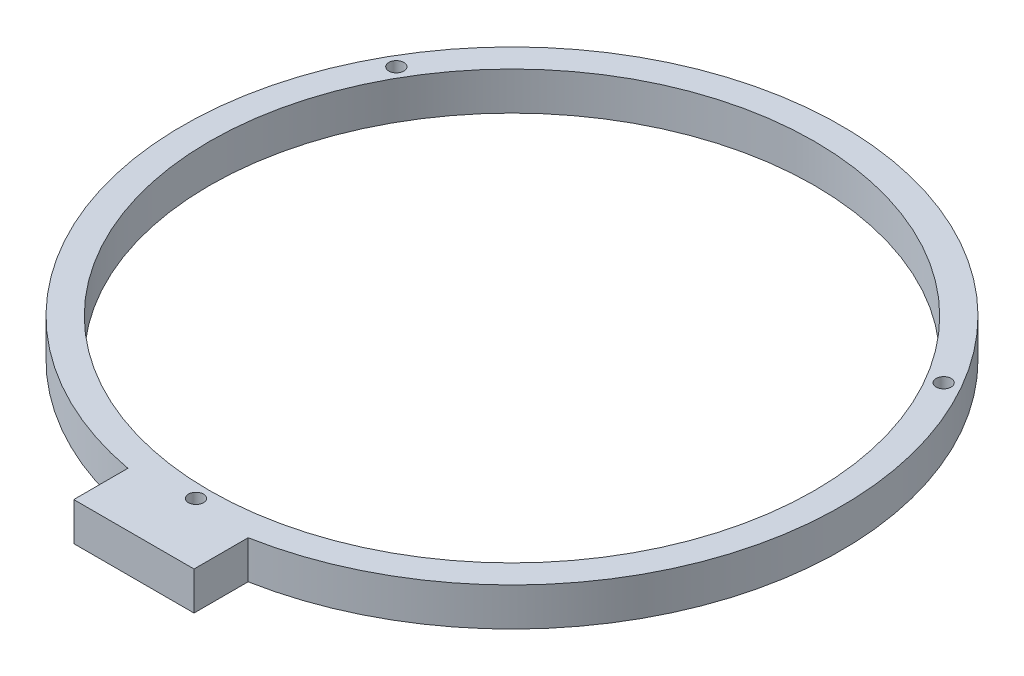
ISO-10303-21;
HEADER;
FILE_DESCRIPTION(('STEP AP214'),'2;1');
FILE_NAME('part.step','',(''),(''),'','','');
FILE_SCHEMA(('AUTOMOTIVE_DESIGN { 1 0 10303 214 1 1 1 1 }'));
ENDSEC;
DATA;
#1=APPLICATION_CONTEXT('core data for automotive mechanical design processes');
#2=APPLICATION_PROTOCOL_DEFINITION('international standard','automotive_design',2000,#1);
#3=PRODUCT_CONTEXT('',#1,'mechanical');
#4=PRODUCT('Part','Part','',(#3));
#5=PRODUCT_RELATED_PRODUCT_CATEGORY('part','',(#4));
#6=PRODUCT_DEFINITION_FORMATION('','',#4);
#7=PRODUCT_DEFINITION_CONTEXT('part definition',#1,'design');
#8=PRODUCT_DEFINITION('design','',#6,#7);
#9=PRODUCT_DEFINITION_SHAPE('','',#8);
#10=(LENGTH_UNIT() NAMED_UNIT(*) SI_UNIT(.MILLI.,.METRE.));
#11=(NAMED_UNIT(*) PLANE_ANGLE_UNIT() SI_UNIT($,.RADIAN.));
#12=(NAMED_UNIT(*) SI_UNIT($,.STERADIAN.) SOLID_ANGLE_UNIT());
#13=UNCERTAINTY_MEASURE_WITH_UNIT(LENGTH_MEASURE(1.E-05),#10,'distance_accuracy_value','');
#14=(GEOMETRIC_REPRESENTATION_CONTEXT(3) GLOBAL_UNCERTAINTY_ASSIGNED_CONTEXT((#13)) GLOBAL_UNIT_ASSIGNED_CONTEXT((#10,
#11,#12)) REPRESENTATION_CONTEXT('',''));
#15=CARTESIAN_POINT('',(0.,0.,0.));
#16=DIRECTION('',(0.,0.,1.));
#17=DIRECTION('',(1.,0.,0.));
#18=AXIS2_PLACEMENT_3D('',#15,#16,#17);
#19=CARTESIAN_POINT('',(0.,6.35,0.));
#20=DIRECTION('',(0.,1.,0.));
#21=DIRECTION('',(0.,0.,1.));
#22=AXIS2_PLACEMENT_3D('',#19,#20,#21);
#23=PLANE('',#22);
#24=CARTESIAN_POINT('',(45.5096349688721,6.35,-26.2750000000002));
#25=DIRECTION('',(0.,1.,0.));
#26=DIRECTION('',(0.866025403784436,0.,-0.500000000000004));
#27=AXIS2_PLACEMENT_3D('',#24,#25,#26);
#28=CIRCLE('',#27,1.25);
#29=CARTESIAN_POINT('',(46.5921667236027,6.35,-26.9000000000002));
#30=VERTEX_POINT('',#29);
#31=EDGE_CURVE('E154',#30,#30,#28,.T.);
#32=ORIENTED_EDGE('',*,*,#31,.F.);
#33=EDGE_LOOP('',(#32));
#34=FACE_BOUND('',#33,.T.);
#35=CARTESIAN_POINT('',(-45.5096349688725,6.35,-26.2749999999996));
#36=DIRECTION('',(0.,1.,0.));
#37=DIRECTION('',(-0.866025403784443,0.,-0.499999999999992));
#38=AXIS2_PLACEMENT_3D('',#35,#36,#37);
#39=CIRCLE('',#38,1.25);
#40=CARTESIAN_POINT('',(-46.592166723603,6.35,-26.8999999999996));
#41=VERTEX_POINT('',#40);
#42=EDGE_CURVE('E155',#41,#41,#39,.T.);
#43=ORIENTED_EDGE('',*,*,#42,.F.);
#44=EDGE_LOOP('',(#43));
#45=FACE_BOUND('',#44,.T.);
#46=CARTESIAN_POINT('',(0.,6.35,52.55));
#47=DIRECTION('',(0.,1.,0.));
#48=DIRECTION('',(0.,0.,1.));
#49=AXIS2_PLACEMENT_3D('',#46,#47,#48);
#50=CIRCLE('',#49,1.25);
#51=CARTESIAN_POINT('',(0.,6.35,53.8));
#52=VERTEX_POINT('',#51);
#53=EDGE_CURVE('E145',#52,#52,#50,.T.);
#54=ORIENTED_EDGE('',*,*,#53,.F.);
#55=EDGE_LOOP('',(#54));
#56=FACE_BOUND('',#55,.T.);
#57=CARTESIAN_POINT('',(0.,6.35,0.));
#58=DIRECTION('',(0.,1.,0.));
#59=DIRECTION('',(0.,0.,1.));
#60=AXIS2_PLACEMENT_3D('',#57,#58,#59);
#61=CIRCLE('',#60,54.8);
#62=CARTESIAN_POINT('',(10.,6.35,53.8798663695448));
#63=VERTEX_POINT('',#62);
#64=CARTESIAN_POINT('',(-10.,6.35,53.8798663695448));
#65=VERTEX_POINT('',#64);
#66=EDGE_CURVE('E96',#63,#65,#61,.T.);
#67=ORIENTED_EDGE('',*,*,#66,.T.);
#68=DIRECTION('',(0.,0.,1.));
#69=VECTOR('',#68,1.);
#70=CARTESIAN_POINT('',(-10.,6.35,53.8798663695448));
#71=LINE('',#70,#69);
#72=CARTESIAN_POINT('',(-10.,6.35,62.8798663695448));
#73=VERTEX_POINT('',#72);
#74=EDGE_CURVE('E91',#65,#73,#71,.T.);
#75=ORIENTED_EDGE('',*,*,#74,.T.);
#76=DIRECTION('',(1.,0.,0.));
#77=VECTOR('',#76,1.);
#78=CARTESIAN_POINT('',(-10.,6.35,62.8798663695448));
#79=LINE('',#78,#77);
#80=CARTESIAN_POINT('',(10.,6.35,62.8798663695448));
#81=VERTEX_POINT('',#80);
#82=EDGE_CURVE('E94',#73,#81,#79,.T.);
#83=ORIENTED_EDGE('',*,*,#82,.T.);
#84=DIRECTION('',(0.,0.,-1.));
#85=VECTOR('',#84,1.);
#86=CARTESIAN_POINT('',(10.,6.35,62.8798663695448));
#87=LINE('',#86,#85);
#88=EDGE_CURVE('E61',#81,#63,#87,.T.);
#89=ORIENTED_EDGE('',*,*,#88,.T.);
#90=EDGE_LOOP('',(#67,#75,#83,#89));
#91=FACE_BOUND('',#90,.T.);
#92=CARTESIAN_POINT('',(0.,6.35,0.));
#93=DIRECTION('',(0.,1.,0.));
#94=DIRECTION('',(0.,0.,1.));
#95=AXIS2_PLACEMENT_3D('',#92,#93,#94);
#96=CIRCLE('',#95,50.3);
#97=CARTESIAN_POINT('',(0.,6.35,50.3));
#98=VERTEX_POINT('',#97);
#99=EDGE_CURVE('E116',#98,#98,#96,.T.);
#100=ORIENTED_EDGE('',*,*,#99,.F.);
#101=EDGE_LOOP('',(#100));
#102=FACE_BOUND('',#101,.T.);
#103=ADVANCED_FACE('F43',(#34,#45,#56,#91,#102),#23,.T.);
#104=CARTESIAN_POINT('',(0.,0.,0.));
#105=DIRECTION('',(0.,1.,0.));
#106=DIRECTION('',(0.,0.,1.));
#107=AXIS2_PLACEMENT_3D('',#104,#105,#106);
#108=PLANE('',#107);
#109=CARTESIAN_POINT('',(45.5096349688721,0.,-26.2750000000002));
#110=DIRECTION('',(0.,1.,0.));
#111=DIRECTION('',(0.,0.,1.));
#112=AXIS2_PLACEMENT_3D('',#109,#110,#111);
#113=CIRCLE('',#112,1.25);
#114=CARTESIAN_POINT('',(45.5096349688721,0.,-25.0250000000002));
#115=VERTEX_POINT('',#114);
#116=EDGE_CURVE('E149',#115,#115,#113,.F.);
#117=ORIENTED_EDGE('',*,*,#116,.F.);
#118=EDGE_LOOP('',(#117));
#119=FACE_BOUND('',#118,.T.);
#120=CARTESIAN_POINT('',(-45.5096349688725,0.,-26.2749999999996));
#121=DIRECTION('',(0.,1.,0.));
#122=DIRECTION('',(0.,0.,1.));
#123=AXIS2_PLACEMENT_3D('',#120,#121,#122);
#124=CIRCLE('',#123,1.25);
#125=CARTESIAN_POINT('',(-45.5096349688725,0.,-25.0249999999996));
#126=VERTEX_POINT('',#125);
#127=EDGE_CURVE('E150',#126,#126,#124,.F.);
#128=ORIENTED_EDGE('',*,*,#127,.F.);
#129=EDGE_LOOP('',(#128));
#130=FACE_BOUND('',#129,.T.);
#131=CARTESIAN_POINT('',(0.,0.,52.55));
#132=DIRECTION('',(0.,1.,0.));
#133=DIRECTION('',(0.,0.,1.));
#134=AXIS2_PLACEMENT_3D('',#131,#132,#133);
#135=CIRCLE('',#134,1.25);
#136=CARTESIAN_POINT('',(0.,0.,53.8));
#137=VERTEX_POINT('',#136);
#138=EDGE_CURVE('E138',#137,#137,#135,.F.);
#139=ORIENTED_EDGE('',*,*,#138,.F.);
#140=EDGE_LOOP('',(#139));
#141=FACE_BOUND('',#140,.T.);
#142=CARTESIAN_POINT('',(0.,0.,0.));
#143=DIRECTION('',(0.,1.,0.));
#144=DIRECTION('',(0.,0.,1.));
#145=AXIS2_PLACEMENT_3D('',#142,#143,#144);
#146=CIRCLE('',#145,54.8);
#147=CARTESIAN_POINT('',(10.,0.,53.8798663695448));
#148=VERTEX_POINT('',#147);
#149=CARTESIAN_POINT('',(-10.,0.,53.8798663695448));
#150=VERTEX_POINT('',#149);
#151=EDGE_CURVE('E112',#148,#150,#146,.T.);
#152=ORIENTED_EDGE('',*,*,#151,.F.);
#153=DIRECTION('',(0.,0.,-1.));
#154=VECTOR('',#153,1.);
#155=CARTESIAN_POINT('',(10.,0.,62.8798663695448));
#156=LINE('',#155,#154);
#157=CARTESIAN_POINT('',(10.,0.,62.8798663695448));
#158=VERTEX_POINT('',#157);
#159=EDGE_CURVE('E84',#158,#148,#156,.T.);
#160=ORIENTED_EDGE('',*,*,#159,.F.);
#161=DIRECTION('',(1.,0.,0.));
#162=VECTOR('',#161,1.);
#163=CARTESIAN_POINT('',(-10.,0.,62.8798663695448));
#164=LINE('',#163,#162);
#165=CARTESIAN_POINT('',(-10.,0.,62.8798663695448));
#166=VERTEX_POINT('',#165);
#167=EDGE_CURVE('E78',#166,#158,#164,.T.);
#168=ORIENTED_EDGE('',*,*,#167,.F.);
#169=DIRECTION('',(0.,0.,1.));
#170=VECTOR('',#169,1.);
#171=CARTESIAN_POINT('',(-10.,0.,53.8798663695448));
#172=LINE('',#171,#170);
#173=EDGE_CURVE('E101',#150,#166,#172,.T.);
#174=ORIENTED_EDGE('',*,*,#173,.F.);
#175=EDGE_LOOP('',(#152,#160,#168,#174));
#176=FACE_BOUND('',#175,.T.);
#177=CARTESIAN_POINT('',(0.,0.,0.));
#178=DIRECTION('',(0.,1.,0.));
#179=DIRECTION('',(0.,0.,1.));
#180=AXIS2_PLACEMENT_3D('',#177,#178,#179);
#181=CIRCLE('',#180,50.3);
#182=CARTESIAN_POINT('',(0.,0.,50.3));
#183=VERTEX_POINT('',#182);
#184=EDGE_CURVE('E134',#183,#183,#181,.T.);
#185=ORIENTED_EDGE('',*,*,#184,.T.);
#186=EDGE_LOOP('',(#185));
#187=FACE_BOUND('',#186,.T.);
#188=ADVANCED_FACE('F129',(#119,#130,#141,#176,#187),#108,.F.);
#189=CARTESIAN_POINT('',(0.,6.35,0.));
#190=DIRECTION('',(0.,-1.,0.));
#191=DIRECTION('',(0.,0.,-1.));
#192=AXIS2_PLACEMENT_3D('',#189,#190,#191);
#193=CYLINDRICAL_SURFACE('',#192,54.8);
#194=ORIENTED_EDGE('',*,*,#151,.T.);
#195=DIRECTION('',(0.,-1.,0.));
#196=VECTOR('',#195,1.);
#197=CARTESIAN_POINT('',(-10.,6.35,53.8798663695448));
#198=LINE('',#197,#196);
#199=EDGE_CURVE('E11',#65,#150,#198,.T.);
#200=ORIENTED_EDGE('',*,*,#199,.F.);
#201=ORIENTED_EDGE('',*,*,#66,.F.);
#202=DIRECTION('',(0.,-1.,0.));
#203=VECTOR('',#202,1.);
#204=CARTESIAN_POINT('',(10.,6.35,53.8798663695448));
#205=LINE('',#204,#203);
#206=EDGE_CURVE('E108',#63,#148,#205,.T.);
#207=ORIENTED_EDGE('',*,*,#206,.T.);
#208=EDGE_LOOP('',(#194,#200,#201,#207));
#209=FACE_BOUND('',#208,.T.);
#210=ADVANCED_FACE('F45',(#209),#193,.T.);
#211=CARTESIAN_POINT('',(-10.,6.35,53.8798663695448));
#212=DIRECTION('',(1.,0.,0.));
#213=DIRECTION('',(0.,0.,-1.));
#214=AXIS2_PLACEMENT_3D('',#211,#212,#213);
#215=PLANE('',#214);
#216=ORIENTED_EDGE('',*,*,#173,.T.);
#217=DIRECTION('',(0.,-1.,0.));
#218=VECTOR('',#217,1.);
#219=CARTESIAN_POINT('',(-10.,6.35,62.8798663695448));
#220=LINE('',#219,#218);
#221=EDGE_CURVE('E53',#73,#166,#220,.T.);
#222=ORIENTED_EDGE('',*,*,#221,.F.);
#223=ORIENTED_EDGE('',*,*,#74,.F.);
#224=ORIENTED_EDGE('',*,*,#199,.T.);
#225=EDGE_LOOP('',(#216,#222,#223,#224));
#226=FACE_BOUND('',#225,.T.);
#227=ADVANCED_FACE('F100',(#226),#215,.F.);
#228=CARTESIAN_POINT('',(-10.,6.35,62.8798663695448));
#229=DIRECTION('',(0.,0.,-1.));
#230=DIRECTION('',(-1.,0.,0.));
#231=AXIS2_PLACEMENT_3D('',#228,#229,#230);
#232=PLANE('',#231);
#233=ORIENTED_EDGE('',*,*,#167,.T.);
#234=DIRECTION('',(0.,-1.,0.));
#235=VECTOR('',#234,1.);
#236=CARTESIAN_POINT('',(10.,6.35,62.8798663695448));
#237=LINE('',#236,#235);
#238=EDGE_CURVE('E103',#81,#158,#237,.T.);
#239=ORIENTED_EDGE('',*,*,#238,.F.);
#240=ORIENTED_EDGE('',*,*,#82,.F.);
#241=ORIENTED_EDGE('',*,*,#221,.T.);
#242=EDGE_LOOP('',(#233,#239,#240,#241));
#243=FACE_BOUND('',#242,.T.);
#244=ADVANCED_FACE('F104',(#243),#232,.F.);
#245=CARTESIAN_POINT('',(10.,6.35,62.8798663695448));
#246=DIRECTION('',(-1.,0.,0.));
#247=DIRECTION('',(0.,0.,1.));
#248=AXIS2_PLACEMENT_3D('',#245,#246,#247);
#249=PLANE('',#248);
#250=ORIENTED_EDGE('',*,*,#159,.T.);
#251=ORIENTED_EDGE('',*,*,#206,.F.);
#252=ORIENTED_EDGE('',*,*,#88,.F.);
#253=ORIENTED_EDGE('',*,*,#238,.T.);
#254=EDGE_LOOP('',(#250,#251,#252,#253));
#255=FACE_BOUND('',#254,.T.);
#256=ADVANCED_FACE('F126',(#255),#249,.F.);
#257=CARTESIAN_POINT('',(0.,6.35,0.));
#258=DIRECTION('',(0.,-1.,0.));
#259=DIRECTION('',(0.,0.,-1.));
#260=AXIS2_PLACEMENT_3D('',#257,#258,#259);
#261=CYLINDRICAL_SURFACE('',#260,50.3);
#262=ORIENTED_EDGE('',*,*,#99,.T.);
#263=EDGE_LOOP('',(#262));
#264=FACE_BOUND('',#263,.T.);
#265=ORIENTED_EDGE('',*,*,#184,.F.);
#266=EDGE_LOOP('',(#265));
#267=FACE_BOUND('',#266,.T.);
#268=ADVANCED_FACE('F180',(#264,#267),#261,.F.);
#269=CARTESIAN_POINT('',(0.,-0.00100000000000013,52.55));
#270=DIRECTION('',(0.,1.,0.));
#271=DIRECTION('',(0.,0.,1.));
#272=AXIS2_PLACEMENT_3D('',#269,#270,#271);
#273=CYLINDRICAL_SURFACE('',#272,1.25);
#274=ORIENTED_EDGE('',*,*,#53,.T.);
#275=EDGE_LOOP('',(#274));
#276=FACE_BOUND('',#275,.T.);
#277=ORIENTED_EDGE('',*,*,#138,.T.);
#278=EDGE_LOOP('',(#277));
#279=FACE_BOUND('',#278,.T.);
#280=ADVANCED_FACE('F176',(#276,#279),#273,.F.);
#281=CARTESIAN_POINT('',(-45.5096349688725,-0.00100000000000013,-26.2749999999996));
#282=DIRECTION('',(0.,1.,0.));
#283=DIRECTION('',(0.,0.,1.));
#284=AXIS2_PLACEMENT_3D('',#281,#282,#283);
#285=CYLINDRICAL_SURFACE('',#284,1.25);
#286=ORIENTED_EDGE('',*,*,#42,.T.);
#287=EDGE_LOOP('',(#286));
#288=FACE_BOUND('',#287,.T.);
#289=ORIENTED_EDGE('',*,*,#127,.T.);
#290=EDGE_LOOP('',(#289));
#291=FACE_BOUND('',#290,.T.);
#292=ADVANCED_FACE('F179',(#288,#291),#285,.F.);
#293=CARTESIAN_POINT('',(45.5096349688721,-0.00100000000000013,-26.2750000000002));
#294=DIRECTION('',(0.,1.,0.));
#295=DIRECTION('',(0.,0.,1.));
#296=AXIS2_PLACEMENT_3D('',#293,#294,#295);
#297=CYLINDRICAL_SURFACE('',#296,1.25);
#298=ORIENTED_EDGE('',*,*,#31,.T.);
#299=EDGE_LOOP('',(#298));
#300=FACE_BOUND('',#299,.T.);
#301=ORIENTED_EDGE('',*,*,#116,.T.);
#302=EDGE_LOOP('',(#301));
#303=FACE_BOUND('',#302,.T.);
#304=ADVANCED_FACE('F166',(#300,#303),#297,.F.);
#305=CLOSED_SHELL('',(#103,#188,#210,#227,#244,#256,#268,#280,#292,#304));
#306=MANIFOLD_SOLID_BREP('B2',#305);
#307=ADVANCED_BREP_SHAPE_REPRESENTATION('',(#18,#306),#14);
#308=SHAPE_DEFINITION_REPRESENTATION(#9,#307);
ENDSEC;
END-ISO-10303-21;
